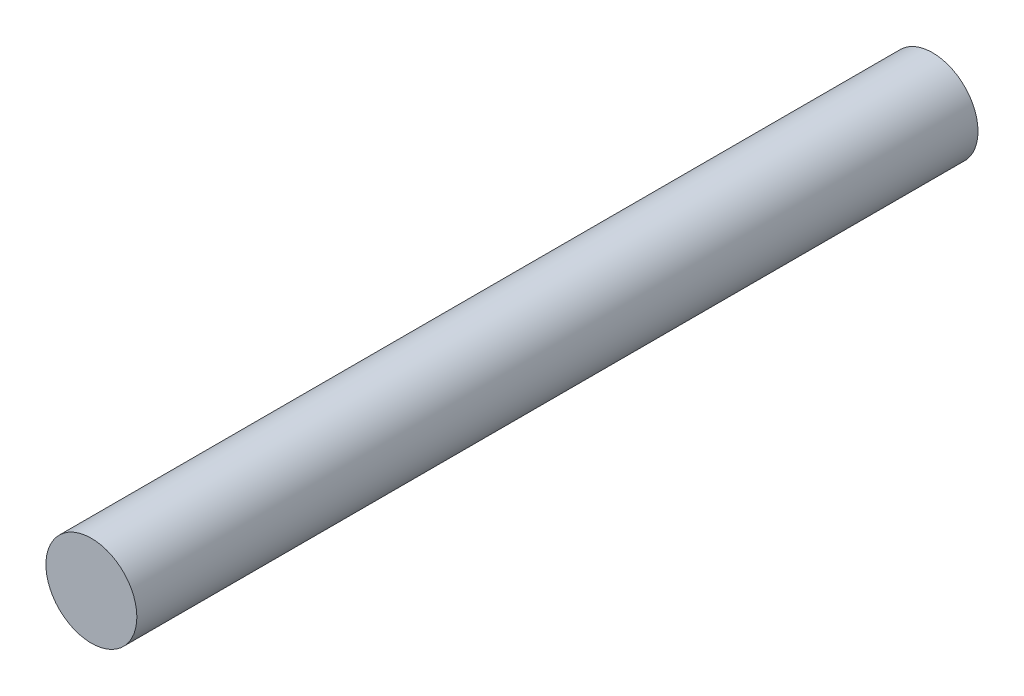
ISO-10303-21;
HEADER;
FILE_DESCRIPTION(('STEP AP214'),'2;1');
FILE_NAME('part.step','',(''),(''),'','','');
FILE_SCHEMA(('AUTOMOTIVE_DESIGN { 1 0 10303 214 1 1 1 1 }'));
ENDSEC;
DATA;
#1=APPLICATION_CONTEXT('core data for automotive mechanical design processes');
#2=APPLICATION_PROTOCOL_DEFINITION('international standard','automotive_design',2000,#1);
#3=PRODUCT_CONTEXT('',#1,'mechanical');
#4=PRODUCT('Part','Part','',(#3));
#5=PRODUCT_RELATED_PRODUCT_CATEGORY('part','',(#4));
#6=PRODUCT_DEFINITION_FORMATION('','',#4);
#7=PRODUCT_DEFINITION_CONTEXT('part definition',#1,'design');
#8=PRODUCT_DEFINITION('design','',#6,#7);
#9=PRODUCT_DEFINITION_SHAPE('','',#8);
#10=(LENGTH_UNIT() NAMED_UNIT(*) SI_UNIT(.MILLI.,.METRE.));
#11=(NAMED_UNIT(*) PLANE_ANGLE_UNIT() SI_UNIT($,.RADIAN.));
#12=(NAMED_UNIT(*) SI_UNIT($,.STERADIAN.) SOLID_ANGLE_UNIT());
#13=UNCERTAINTY_MEASURE_WITH_UNIT(LENGTH_MEASURE(1.E-05),#10,'distance_accuracy_value','');
#14=(GEOMETRIC_REPRESENTATION_CONTEXT(3) GLOBAL_UNCERTAINTY_ASSIGNED_CONTEXT((#13)) GLOBAL_UNIT_ASSIGNED_CONTEXT((#10,
#11,#12)) REPRESENTATION_CONTEXT('',''));
#15=CARTESIAN_POINT('',(0.,0.,0.));
#16=DIRECTION('',(0.,0.,1.));
#17=DIRECTION('',(1.,0.,0.));
#18=AXIS2_PLACEMENT_3D('',#15,#16,#17);
#19=CARTESIAN_POINT('',(0.,0.,92.5));
#20=DIRECTION('',(0.,0.,-1.));
#21=DIRECTION('',(-1.,0.,0.));
#22=AXIS2_PLACEMENT_3D('',#19,#20,#21);
#23=CYLINDRICAL_SURFACE('',#22,5.);
#24=CARTESIAN_POINT('',(0.,0.,92.5));
#25=DIRECTION('',(0.,0.,1.));
#26=DIRECTION('',(1.,0.,0.));
#27=AXIS2_PLACEMENT_3D('',#24,#25,#26);
#28=CIRCLE('',#27,5.);
#29=CARTESIAN_POINT('',(5.,0.,92.5));
#30=VERTEX_POINT('',#29);
#31=EDGE_CURVE('E10',#30,#30,#28,.T.);
#32=ORIENTED_EDGE('',*,*,#31,.F.);
#33=EDGE_LOOP('',(#32));
#34=FACE_BOUND('',#33,.T.);
#35=CARTESIAN_POINT('',(0.,0.,0.));
#36=DIRECTION('',(0.,0.,1.));
#37=DIRECTION('',(1.,0.,0.));
#38=AXIS2_PLACEMENT_3D('',#35,#36,#37);
#39=CIRCLE('',#38,5.);
#40=CARTESIAN_POINT('',(5.,0.,0.));
#41=VERTEX_POINT('',#40);
#42=EDGE_CURVE('E40',#41,#41,#39,.T.);
#43=ORIENTED_EDGE('',*,*,#42,.T.);
#44=EDGE_LOOP('',(#43));
#45=FACE_BOUND('',#44,.T.);
#46=ADVANCED_FACE('F37',(#34,#45),#23,.T.);
#47=CARTESIAN_POINT('',(0.,0.,92.5));
#48=DIRECTION('',(0.,0.,1.));
#49=DIRECTION('',(1.,0.,0.));
#50=AXIS2_PLACEMENT_3D('',#47,#48,#49);
#51=PLANE('',#50);
#52=ORIENTED_EDGE('',*,*,#31,.T.);
#53=EDGE_LOOP('',(#52));
#54=FACE_BOUND('',#53,.T.);
#55=ADVANCED_FACE('F52',(#54),#51,.T.);
#56=CARTESIAN_POINT('',(0.,0.,0.));
#57=DIRECTION('',(0.,0.,1.));
#58=DIRECTION('',(1.,0.,0.));
#59=AXIS2_PLACEMENT_3D('',#56,#57,#58);
#60=PLANE('',#59);
#61=ORIENTED_EDGE('',*,*,#42,.F.);
#62=EDGE_LOOP('',(#61));
#63=FACE_BOUND('',#62,.T.);
#64=ADVANCED_FACE('F50',(#63),#60,.F.);
#65=CLOSED_SHELL('',(#46,#55,#64));
#66=MANIFOLD_SOLID_BREP('B2',#65);
#67=ADVANCED_BREP_SHAPE_REPRESENTATION('',(#18,#66),#14);
#68=SHAPE_DEFINITION_REPRESENTATION(#9,#67);
ENDSEC;
END-ISO-10303-21;
